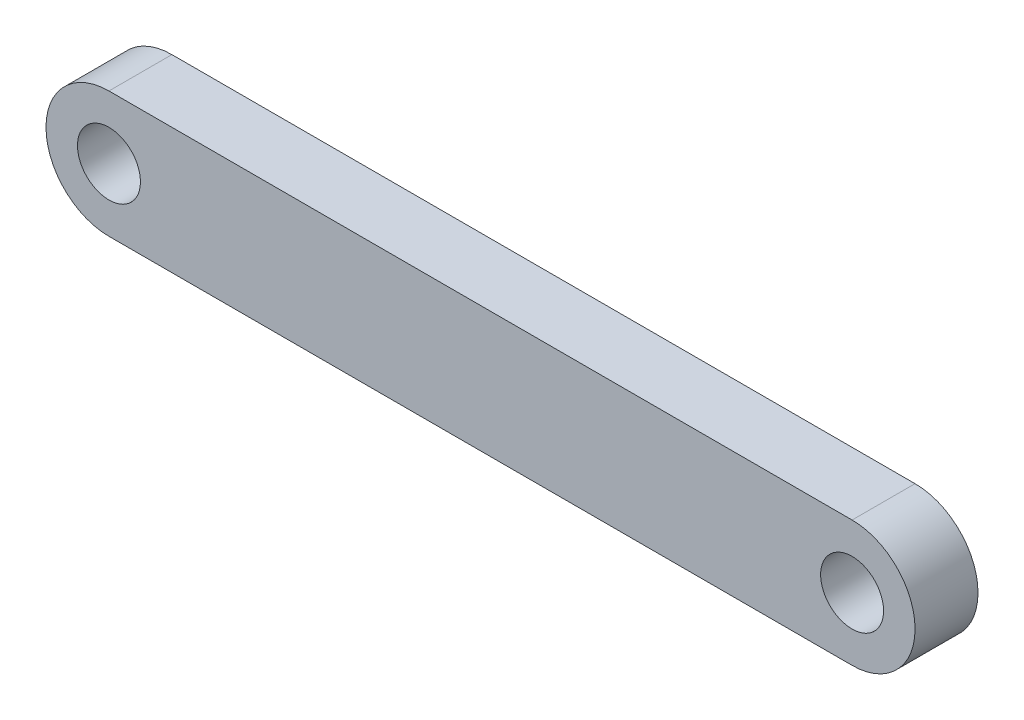
ISO-10303-21;
HEADER;
FILE_DESCRIPTION(('STEP AP214'),'2;1');
FILE_NAME('part.step','',(''),(''),'','','');
FILE_SCHEMA(('AUTOMOTIVE_DESIGN { 1 0 10303 214 1 1 1 1 }'));
ENDSEC;
DATA;
#1=APPLICATION_CONTEXT('core data for automotive mechanical design processes');
#2=APPLICATION_PROTOCOL_DEFINITION('international standard','automotive_design',2000,#1);
#3=PRODUCT_CONTEXT('',#1,'mechanical');
#4=PRODUCT('Part','Part','',(#3));
#5=PRODUCT_RELATED_PRODUCT_CATEGORY('part','',(#4));
#6=PRODUCT_DEFINITION_FORMATION('','',#4);
#7=PRODUCT_DEFINITION_CONTEXT('part definition',#1,'design');
#8=PRODUCT_DEFINITION('design','',#6,#7);
#9=PRODUCT_DEFINITION_SHAPE('','',#8);
#10=(LENGTH_UNIT() NAMED_UNIT(*) SI_UNIT(.MILLI.,.METRE.));
#11=(NAMED_UNIT(*) PLANE_ANGLE_UNIT() SI_UNIT($,.RADIAN.));
#12=(NAMED_UNIT(*) SI_UNIT($,.STERADIAN.) SOLID_ANGLE_UNIT());
#13=UNCERTAINTY_MEASURE_WITH_UNIT(LENGTH_MEASURE(1.E-05),#10,'distance_accuracy_value','');
#14=(GEOMETRIC_REPRESENTATION_CONTEXT(3) GLOBAL_UNCERTAINTY_ASSIGNED_CONTEXT((#13)) GLOBAL_UNIT_ASSIGNED_CONTEXT((#10,
#11,#12)) REPRESENTATION_CONTEXT('',''));
#15=CARTESIAN_POINT('',(0.,0.,0.));
#16=DIRECTION('',(0.,0.,1.));
#17=DIRECTION('',(1.,0.,0.));
#18=AXIS2_PLACEMENT_3D('',#15,#16,#17);
#19=CARTESIAN_POINT('',(-11.8049999842858,0.000609108695828989,2.));
#20=DIRECTION('',(0.,0.,1.));
#21=DIRECTION('',(1.,0.,0.));
#22=AXIS2_PLACEMENT_3D('',#19,#20,#21);
#23=PLANE('',#22);
#24=CARTESIAN_POINT('',(-11.8049999842858,0.000609108695828989,2.));
#25=DIRECTION('',(0.,0.,1.));
#26=DIRECTION('',(1.,0.,0.));
#27=AXIS2_PLACEMENT_3D('',#24,#25,#26);
#28=CIRCLE('',#27,1.);
#29=CARTESIAN_POINT('',(-10.8049999842858,0.000609108695828989,2.));
#30=VERTEX_POINT('',#29);
#31=EDGE_CURVE('E100',#30,#30,#28,.T.);
#32=ORIENTED_EDGE('',*,*,#31,.F.);
#33=EDGE_LOOP('',(#32));
#34=FACE_BOUND('',#33,.T.);
#35=CARTESIAN_POINT('',(-11.8049999842858,0.000609108695828989,2.));
#36=DIRECTION('',(0.,0.,1.));
#37=DIRECTION('',(1.,0.,0.));
#38=AXIS2_PLACEMENT_3D('',#35,#36,#37);
#39=CIRCLE('',#38,2.);
#40=CARTESIAN_POINT('',(-11.8049999842858,2.00060910869583,2.));
#41=VERTEX_POINT('',#40);
#42=CARTESIAN_POINT('',(-11.8049999842858,-1.99939089130417,2.));
#43=VERTEX_POINT('',#42);
#44=EDGE_CURVE('E85',#41,#43,#39,.T.);
#45=ORIENTED_EDGE('',*,*,#44,.T.);
#46=DIRECTION('',(1.,0.,0.));
#47=VECTOR('',#46,1.);
#48=CARTESIAN_POINT('',(-11.8049999842858,-1.99939089130417,2.));
#49=LINE('',#48,#47);
#50=CARTESIAN_POINT('',(11.8050000157142,-1.99939089130417,2.));
#51=VERTEX_POINT('',#50);
#52=EDGE_CURVE('E80',#43,#51,#49,.T.);
#53=ORIENTED_EDGE('',*,*,#52,.T.);
#54=CARTESIAN_POINT('',(11.8050000157142,0.000609108695828989,2.));
#55=DIRECTION('',(0.,0.,1.));
#56=DIRECTION('',(1.,0.,0.));
#57=AXIS2_PLACEMENT_3D('',#54,#55,#56);
#58=CIRCLE('',#57,2.);
#59=CARTESIAN_POINT('',(11.8050000157142,2.00060910869583,2.));
#60=VERTEX_POINT('',#59);
#61=EDGE_CURVE('E83',#51,#60,#58,.T.);
#62=ORIENTED_EDGE('',*,*,#61,.T.);
#63=DIRECTION('',(-1.,0.,0.));
#64=VECTOR('',#63,1.);
#65=CARTESIAN_POINT('',(-11.8049999842858,2.00060910869583,2.));
#66=LINE('',#65,#64);
#67=EDGE_CURVE('E50',#60,#41,#66,.T.);
#68=ORIENTED_EDGE('',*,*,#67,.T.);
#69=EDGE_LOOP('',(#45,#53,#62,#68));
#70=FACE_BOUND('',#69,.T.);
#71=CARTESIAN_POINT('',(11.8050000157142,0.000609108695828989,2.));
#72=DIRECTION('',(0.,0.,1.));
#73=DIRECTION('',(1.,0.,0.));
#74=AXIS2_PLACEMENT_3D('',#71,#72,#73);
#75=CIRCLE('',#74,1.);
#76=CARTESIAN_POINT('',(12.8050000157142,0.000609108695828989,2.));
#77=VERTEX_POINT('',#76);
#78=EDGE_CURVE('E115',#77,#77,#75,.T.);
#79=ORIENTED_EDGE('',*,*,#78,.F.);
#80=EDGE_LOOP('',(#79));
#81=FACE_BOUND('',#80,.T.);
#82=ADVANCED_FACE('F33',(#34,#70,#81),#23,.T.);
#83=CARTESIAN_POINT('',(-11.8049999842858,0.000609108695828989,0.));
#84=DIRECTION('',(0.,0.,1.));
#85=DIRECTION('',(1.,0.,0.));
#86=AXIS2_PLACEMENT_3D('',#83,#84,#85);
#87=PLANE('',#86);
#88=CARTESIAN_POINT('',(-11.8049999842858,0.000609108695828989,0.));
#89=DIRECTION('',(0.,0.,1.));
#90=DIRECTION('',(1.,0.,0.));
#91=AXIS2_PLACEMENT_3D('',#88,#89,#90);
#92=CIRCLE('',#91,2.);
#93=CARTESIAN_POINT('',(-11.8049999842858,2.00060910869583,0.));
#94=VERTEX_POINT('',#93);
#95=CARTESIAN_POINT('',(-11.8049999842858,-1.99939089130417,0.));
#96=VERTEX_POINT('',#95);
#97=EDGE_CURVE('E97',#94,#96,#92,.T.);
#98=ORIENTED_EDGE('',*,*,#97,.F.);
#99=DIRECTION('',(-1.,0.,0.));
#100=VECTOR('',#99,1.);
#101=CARTESIAN_POINT('',(-11.8049999842858,2.00060910869583,0.));
#102=LINE('',#101,#100);
#103=CARTESIAN_POINT('',(11.8050000157142,2.00060910869583,0.));
#104=VERTEX_POINT('',#103);
#105=EDGE_CURVE('E73',#104,#94,#102,.T.);
#106=ORIENTED_EDGE('',*,*,#105,.F.);
#107=CARTESIAN_POINT('',(11.8050000157142,0.000609108695828989,0.));
#108=DIRECTION('',(0.,0.,1.));
#109=DIRECTION('',(1.,0.,0.));
#110=AXIS2_PLACEMENT_3D('',#107,#108,#109);
#111=CIRCLE('',#110,2.);
#112=CARTESIAN_POINT('',(11.8050000157142,-1.99939089130417,0.));
#113=VERTEX_POINT('',#112);
#114=EDGE_CURVE('E67',#113,#104,#111,.T.);
#115=ORIENTED_EDGE('',*,*,#114,.F.);
#116=DIRECTION('',(1.,0.,0.));
#117=VECTOR('',#116,1.);
#118=CARTESIAN_POINT('',(-11.8049999842858,-1.99939089130417,0.));
#119=LINE('',#118,#117);
#120=EDGE_CURVE('E89',#96,#113,#119,.T.);
#121=ORIENTED_EDGE('',*,*,#120,.F.);
#122=EDGE_LOOP('',(#98,#106,#115,#121));
#123=FACE_BOUND('',#122,.T.);
#124=CARTESIAN_POINT('',(-11.8049999842858,0.000609108695828989,0.));
#125=DIRECTION('',(0.,0.,1.));
#126=DIRECTION('',(1.,0.,0.));
#127=AXIS2_PLACEMENT_3D('',#124,#125,#126);
#128=CIRCLE('',#127,1.);
#129=CARTESIAN_POINT('',(-10.8049999842858,0.000609108695828989,0.));
#130=VERTEX_POINT('',#129);
#131=EDGE_CURVE('E112',#130,#130,#128,.T.);
#132=ORIENTED_EDGE('',*,*,#131,.T.);
#133=EDGE_LOOP('',(#132));
#134=FACE_BOUND('',#133,.T.);
#135=CARTESIAN_POINT('',(11.8050000157142,0.000609108695828989,0.));
#136=DIRECTION('',(0.,0.,1.));
#137=DIRECTION('',(1.,0.,0.));
#138=AXIS2_PLACEMENT_3D('',#135,#136,#137);
#139=CIRCLE('',#138,1.);
#140=CARTESIAN_POINT('',(12.8050000157142,0.000609108695828989,0.));
#141=VERTEX_POINT('',#140);
#142=EDGE_CURVE('E118',#141,#141,#139,.T.);
#143=ORIENTED_EDGE('',*,*,#142,.T.);
#144=EDGE_LOOP('',(#143));
#145=FACE_BOUND('',#144,.T.);
#146=ADVANCED_FACE('F108',(#123,#134,#145),#87,.F.);
#147=CARTESIAN_POINT('',(-11.8049999842858,0.000609108695828989,2.));
#148=DIRECTION('',(0.,0.,-1.));
#149=DIRECTION('',(-1.,0.,0.));
#150=AXIS2_PLACEMENT_3D('',#147,#148,#149);
#151=CYLINDRICAL_SURFACE('',#150,2.);
#152=ORIENTED_EDGE('',*,*,#97,.T.);
#153=DIRECTION('',(0.,0.,-1.));
#154=VECTOR('',#153,1.);
#155=CARTESIAN_POINT('',(-11.8049999842858,-1.99939089130417,2.));
#156=LINE('',#155,#154);
#157=EDGE_CURVE('E11',#43,#96,#156,.T.);
#158=ORIENTED_EDGE('',*,*,#157,.F.);
#159=ORIENTED_EDGE('',*,*,#44,.F.);
#160=DIRECTION('',(0.,0.,-1.));
#161=VECTOR('',#160,1.);
#162=CARTESIAN_POINT('',(-11.8049999842858,2.00060910869583,2.));
#163=LINE('',#162,#161);
#164=EDGE_CURVE('E93',#41,#94,#163,.T.);
#165=ORIENTED_EDGE('',*,*,#164,.T.);
#166=EDGE_LOOP('',(#152,#158,#159,#165));
#167=FACE_BOUND('',#166,.T.);
#168=ADVANCED_FACE('F35',(#167),#151,.T.);
#169=CARTESIAN_POINT('',(-11.8049999842858,-1.99939089130417,2.));
#170=DIRECTION('',(0.,1.,0.));
#171=DIRECTION('',(0.,0.,1.));
#172=AXIS2_PLACEMENT_3D('',#169,#170,#171);
#173=PLANE('',#172);
#174=ORIENTED_EDGE('',*,*,#120,.T.);
#175=DIRECTION('',(0.,0.,-1.));
#176=VECTOR('',#175,1.);
#177=CARTESIAN_POINT('',(11.8050000157142,-1.99939089130417,2.));
#178=LINE('',#177,#176);
#179=EDGE_CURVE('E42',#51,#113,#178,.T.);
#180=ORIENTED_EDGE('',*,*,#179,.F.);
#181=ORIENTED_EDGE('',*,*,#52,.F.);
#182=ORIENTED_EDGE('',*,*,#157,.T.);
#183=EDGE_LOOP('',(#174,#180,#181,#182));
#184=FACE_BOUND('',#183,.T.);
#185=ADVANCED_FACE('F88',(#184),#173,.F.);
#186=CARTESIAN_POINT('',(11.8050000157142,0.000609108695828989,2.));
#187=DIRECTION('',(0.,0.,-1.));
#188=DIRECTION('',(-1.,0.,0.));
#189=AXIS2_PLACEMENT_3D('',#186,#187,#188);
#190=CYLINDRICAL_SURFACE('',#189,2.);
#191=ORIENTED_EDGE('',*,*,#114,.T.);
#192=DIRECTION('',(0.,0.,-1.));
#193=VECTOR('',#192,1.);
#194=CARTESIAN_POINT('',(11.8050000157142,2.00060910869583,2.));
#195=LINE('',#194,#193);
#196=EDGE_CURVE('E90',#60,#104,#195,.T.);
#197=ORIENTED_EDGE('',*,*,#196,.F.);
#198=ORIENTED_EDGE('',*,*,#61,.F.);
#199=ORIENTED_EDGE('',*,*,#179,.T.);
#200=EDGE_LOOP('',(#191,#197,#198,#199));
#201=FACE_BOUND('',#200,.T.);
#202=ADVANCED_FACE('F91',(#201),#190,.T.);
#203=CARTESIAN_POINT('',(-11.8049999842858,2.00060910869583,2.));
#204=DIRECTION('',(0.,-1.,0.));
#205=DIRECTION('',(0.,0.,-1.));
#206=AXIS2_PLACEMENT_3D('',#203,#204,#205);
#207=PLANE('',#206);
#208=ORIENTED_EDGE('',*,*,#105,.T.);
#209=ORIENTED_EDGE('',*,*,#164,.F.);
#210=ORIENTED_EDGE('',*,*,#67,.F.);
#211=ORIENTED_EDGE('',*,*,#196,.T.);
#212=EDGE_LOOP('',(#208,#209,#210,#211));
#213=FACE_BOUND('',#212,.T.);
#214=ADVANCED_FACE('F105',(#213),#207,.F.);
#215=CARTESIAN_POINT('',(-11.8049999842858,0.000609108695828989,2.));
#216=DIRECTION('',(0.,0.,-1.));
#217=DIRECTION('',(-1.,0.,0.));
#218=AXIS2_PLACEMENT_3D('',#215,#216,#217);
#219=CYLINDRICAL_SURFACE('',#218,1.);
#220=ORIENTED_EDGE('',*,*,#31,.T.);
#221=EDGE_LOOP('',(#220));
#222=FACE_BOUND('',#221,.T.);
#223=ORIENTED_EDGE('',*,*,#131,.F.);
#224=EDGE_LOOP('',(#223));
#225=FACE_BOUND('',#224,.T.);
#226=ADVANCED_FACE('F135',(#222,#225),#219,.F.);
#227=CARTESIAN_POINT('',(11.8050000157142,0.000609108695828989,2.));
#228=DIRECTION('',(0.,0.,-1.));
#229=DIRECTION('',(-1.,0.,0.));
#230=AXIS2_PLACEMENT_3D('',#227,#228,#229);
#231=CYLINDRICAL_SURFACE('',#230,1.);
#232=ORIENTED_EDGE('',*,*,#78,.T.);
#233=EDGE_LOOP('',(#232));
#234=FACE_BOUND('',#233,.T.);
#235=ORIENTED_EDGE('',*,*,#142,.F.);
#236=EDGE_LOOP('',(#235));
#237=FACE_BOUND('',#236,.T.);
#238=ADVANCED_FACE('F124',(#234,#237),#231,.F.);
#239=CLOSED_SHELL('',(#82,#146,#168,#185,#202,#214,#226,#238));
#240=MANIFOLD_SOLID_BREP('B2',#239);
#241=ADVANCED_BREP_SHAPE_REPRESENTATION('',(#18,#240),#14);
#242=SHAPE_DEFINITION_REPRESENTATION(#9,#241);
ENDSEC;
END-ISO-10303-21;
